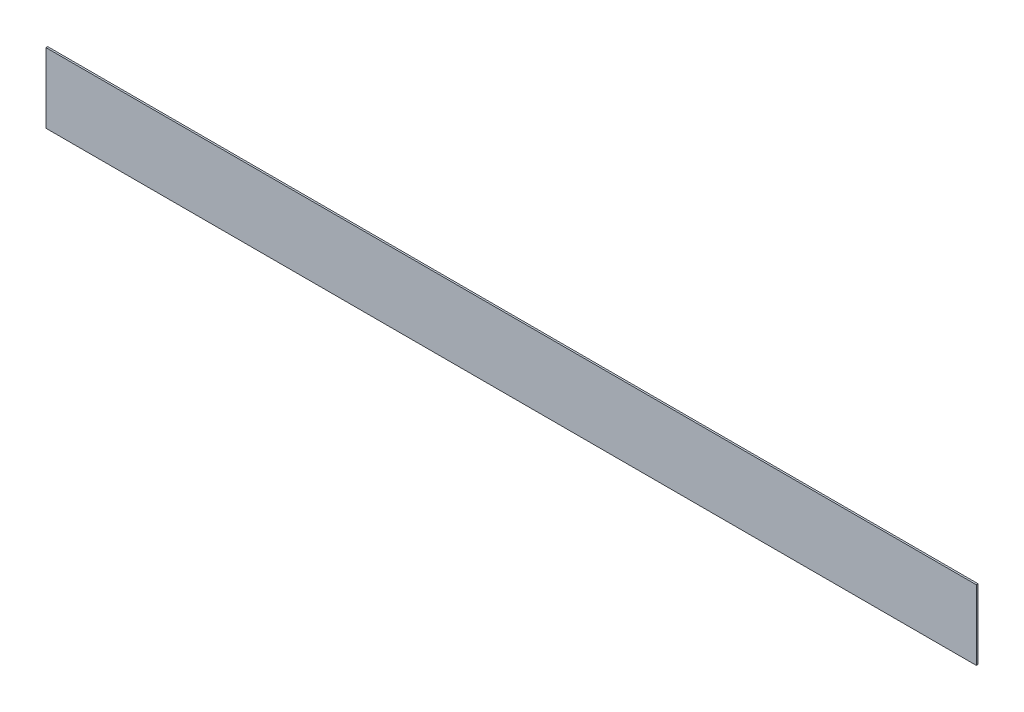
ISO-10303-21;
HEADER;
FILE_DESCRIPTION(('STEP AP214'),'2;1');
FILE_NAME('part.step','',(''),(''),'','','');
FILE_SCHEMA(('AUTOMOTIVE_DESIGN { 1 0 10303 214 1 1 1 1 }'));
ENDSEC;
DATA;
#1=APPLICATION_CONTEXT('core data for automotive mechanical design processes');
#2=APPLICATION_PROTOCOL_DEFINITION('international standard','automotive_design',2000,#1);
#3=PRODUCT_CONTEXT('',#1,'mechanical');
#4=PRODUCT('Part','Part','',(#3));
#5=PRODUCT_RELATED_PRODUCT_CATEGORY('part','',(#4));
#6=PRODUCT_DEFINITION_FORMATION('','',#4);
#7=PRODUCT_DEFINITION_CONTEXT('part definition',#1,'design');
#8=PRODUCT_DEFINITION('design','',#6,#7);
#9=PRODUCT_DEFINITION_SHAPE('','',#8);
#10=(LENGTH_UNIT() NAMED_UNIT(*) SI_UNIT(.MILLI.,.METRE.));
#11=(NAMED_UNIT(*) PLANE_ANGLE_UNIT() SI_UNIT($,.RADIAN.));
#12=(NAMED_UNIT(*) SI_UNIT($,.STERADIAN.) SOLID_ANGLE_UNIT());
#13=UNCERTAINTY_MEASURE_WITH_UNIT(LENGTH_MEASURE(1.E-05),#10,'distance_accuracy_value','');
#14=(GEOMETRIC_REPRESENTATION_CONTEXT(3) GLOBAL_UNCERTAINTY_ASSIGNED_CONTEXT((#13)) GLOBAL_UNIT_ASSIGNED_CONTEXT((#10,
#11,#12)) REPRESENTATION_CONTEXT('',''));
#15=CARTESIAN_POINT('',(0.,0.,0.));
#16=DIRECTION('',(0.,0.,1.));
#17=DIRECTION('',(1.,0.,0.));
#18=AXIS2_PLACEMENT_3D('',#15,#16,#17);
#19=CARTESIAN_POINT('',(0.,0.,2.));
#20=DIRECTION('',(1.,0.,0.));
#21=DIRECTION('',(0.,1.,0.));
#22=AXIS2_PLACEMENT_3D('',#19,#20,#21);
#23=PLANE('',#22);
#24=DIRECTION('',(0.,-1.,0.));
#25=VECTOR('',#24,1.);
#26=CARTESIAN_POINT('',(0.,0.,0.));
#27=LINE('',#26,#25);
#28=CARTESIAN_POINT('',(0.,0.,0.));
#29=VERTEX_POINT('',#28);
#30=CARTESIAN_POINT('',(0.,-80.,0.));
#31=VERTEX_POINT('',#30);
#32=EDGE_CURVE('E100',#29,#31,#27,.T.);
#33=ORIENTED_EDGE('',*,*,#32,.T.);
#34=DIRECTION('',(0.,0.,-1.));
#35=VECTOR('',#34,1.);
#36=CARTESIAN_POINT('',(0.,-80.,2.));
#37=LINE('',#36,#35);
#38=CARTESIAN_POINT('',(0.,-80.,2.));
#39=VERTEX_POINT('',#38);
#40=EDGE_CURVE('E11',#39,#31,#37,.T.);
#41=ORIENTED_EDGE('',*,*,#40,.F.);
#42=DIRECTION('',(0.,-1.,0.));
#43=VECTOR('',#42,1.);
#44=CARTESIAN_POINT('',(0.,0.,2.));
#45=LINE('',#44,#43);
#46=CARTESIAN_POINT('',(0.,0.,2.));
#47=VERTEX_POINT('',#46);
#48=EDGE_CURVE('E88',#47,#39,#45,.T.);
#49=ORIENTED_EDGE('',*,*,#48,.F.);
#50=DIRECTION('',(0.,0.,-1.));
#51=VECTOR('',#50,1.);
#52=CARTESIAN_POINT('',(0.,0.,2.));
#53=LINE('',#52,#51);
#54=EDGE_CURVE('E96',#47,#29,#53,.T.);
#55=ORIENTED_EDGE('',*,*,#54,.T.);
#56=EDGE_LOOP('',(#33,#41,#49,#55));
#57=FACE_BOUND('',#56,.T.);
#58=ADVANCED_FACE('F37',(#57),#23,.F.);
#59=CARTESIAN_POINT('',(0.,-80.,2.));
#60=DIRECTION('',(0.,1.,0.));
#61=DIRECTION('',(-1.,0.,0.));
#62=AXIS2_PLACEMENT_3D('',#59,#60,#61);
#63=PLANE('',#62);
#64=DIRECTION('',(1.,0.,0.));
#65=VECTOR('',#64,1.);
#66=CARTESIAN_POINT('',(0.,-80.,0.));
#67=LINE('',#66,#65);
#68=CARTESIAN_POINT('',(1065.,-80.,0.));
#69=VERTEX_POINT('',#68);
#70=EDGE_CURVE('E92',#31,#69,#67,.T.);
#71=ORIENTED_EDGE('',*,*,#70,.T.);
#72=DIRECTION('',(0.,0.,-1.));
#73=VECTOR('',#72,1.);
#74=CARTESIAN_POINT('',(1065.,-80.,2.));
#75=LINE('',#74,#73);
#76=CARTESIAN_POINT('',(1065.,-80.,2.));
#77=VERTEX_POINT('',#76);
#78=EDGE_CURVE('E45',#77,#69,#75,.T.);
#79=ORIENTED_EDGE('',*,*,#78,.F.);
#80=DIRECTION('',(1.,0.,0.));
#81=VECTOR('',#80,1.);
#82=CARTESIAN_POINT('',(0.,-80.,2.));
#83=LINE('',#82,#81);
#84=EDGE_CURVE('E83',#39,#77,#83,.T.);
#85=ORIENTED_EDGE('',*,*,#84,.F.);
#86=ORIENTED_EDGE('',*,*,#40,.T.);
#87=EDGE_LOOP('',(#71,#79,#85,#86));
#88=FACE_BOUND('',#87,.T.);
#89=ADVANCED_FACE('F91',(#88),#63,.F.);
#90=CARTESIAN_POINT('',(1065.,0.,2.));
#91=DIRECTION('',(-1.,0.,0.));
#92=DIRECTION('',(0.,0.,1.));
#93=AXIS2_PLACEMENT_3D('',#90,#91,#92);
#94=PLANE('',#93);
#95=DIRECTION('',(0.,1.,0.));
#96=VECTOR('',#95,1.);
#97=CARTESIAN_POINT('',(1065.,0.,0.));
#98=LINE('',#97,#96);
#99=CARTESIAN_POINT('',(1065.,0.,0.));
#100=VERTEX_POINT('',#99);
#101=EDGE_CURVE('E70',#69,#100,#98,.T.);
#102=ORIENTED_EDGE('',*,*,#101,.T.);
#103=DIRECTION('',(0.,0.,-1.));
#104=VECTOR('',#103,1.);
#105=CARTESIAN_POINT('',(1065.,0.,2.));
#106=LINE('',#105,#104);
#107=CARTESIAN_POINT('',(1065.,0.,2.));
#108=VERTEX_POINT('',#107);
#109=EDGE_CURVE('E93',#108,#100,#106,.T.);
#110=ORIENTED_EDGE('',*,*,#109,.F.);
#111=DIRECTION('',(0.,1.,0.));
#112=VECTOR('',#111,1.);
#113=CARTESIAN_POINT('',(1065.,0.,2.));
#114=LINE('',#113,#112);
#115=EDGE_CURVE('E86',#77,#108,#114,.T.);
#116=ORIENTED_EDGE('',*,*,#115,.F.);
#117=ORIENTED_EDGE('',*,*,#78,.T.);
#118=EDGE_LOOP('',(#102,#110,#116,#117));
#119=FACE_BOUND('',#118,.T.);
#120=ADVANCED_FACE('F94',(#119),#94,.F.);
#121=CARTESIAN_POINT('',(0.,0.,2.));
#122=DIRECTION('',(0.,-1.,0.));
#123=DIRECTION('',(0.,0.,-1.));
#124=AXIS2_PLACEMENT_3D('',#121,#122,#123);
#125=PLANE('',#124);
#126=DIRECTION('',(-1.,0.,0.));
#127=VECTOR('',#126,1.);
#128=CARTESIAN_POINT('',(0.,0.,0.));
#129=LINE('',#128,#127);
#130=EDGE_CURVE('E76',#100,#29,#129,.T.);
#131=ORIENTED_EDGE('',*,*,#130,.T.);
#132=ORIENTED_EDGE('',*,*,#54,.F.);
#133=DIRECTION('',(-1.,0.,0.));
#134=VECTOR('',#133,1.);
#135=CARTESIAN_POINT('',(0.,0.,2.));
#136=LINE('',#135,#134);
#137=EDGE_CURVE('E53',#108,#47,#136,.T.);
#138=ORIENTED_EDGE('',*,*,#137,.F.);
#139=ORIENTED_EDGE('',*,*,#109,.T.);
#140=EDGE_LOOP('',(#131,#132,#138,#139));
#141=FACE_BOUND('',#140,.T.);
#142=ADVANCED_FACE('F107',(#141),#125,.F.);
#143=CARTESIAN_POINT('',(0.,0.,2.));
#144=DIRECTION('',(0.,0.,1.));
#145=DIRECTION('',(1.,0.,0.));
#146=AXIS2_PLACEMENT_3D('',#143,#144,#145);
#147=PLANE('',#146);
#148=ORIENTED_EDGE('',*,*,#48,.T.);
#149=ORIENTED_EDGE('',*,*,#84,.T.);
#150=ORIENTED_EDGE('',*,*,#115,.T.);
#151=ORIENTED_EDGE('',*,*,#137,.T.);
#152=EDGE_LOOP('',(#148,#149,#150,#151));
#153=FACE_BOUND('',#152,.T.);
#154=ADVANCED_FACE('F84',(#153),#147,.T.);
#155=CARTESIAN_POINT('',(0.,0.,0.));
#156=DIRECTION('',(0.,0.,1.));
#157=DIRECTION('',(1.,0.,0.));
#158=AXIS2_PLACEMENT_3D('',#155,#156,#157);
#159=PLANE('',#158);
#160=ORIENTED_EDGE('',*,*,#32,.F.);
#161=ORIENTED_EDGE('',*,*,#130,.F.);
#162=ORIENTED_EDGE('',*,*,#101,.F.);
#163=ORIENTED_EDGE('',*,*,#70,.F.);
#164=EDGE_LOOP('',(#160,#161,#162,#163));
#165=FACE_BOUND('',#164,.T.);
#166=ADVANCED_FACE('F110',(#165),#159,.F.);
#167=CLOSED_SHELL('',(#58,#89,#120,#142,#154,#166));
#168=MANIFOLD_SOLID_BREP('B2',#167);
#169=ADVANCED_BREP_SHAPE_REPRESENTATION('',(#18,#168),#14);
#170=SHAPE_DEFINITION_REPRESENTATION(#9,#169);
ENDSEC;
END-ISO-10303-21;
